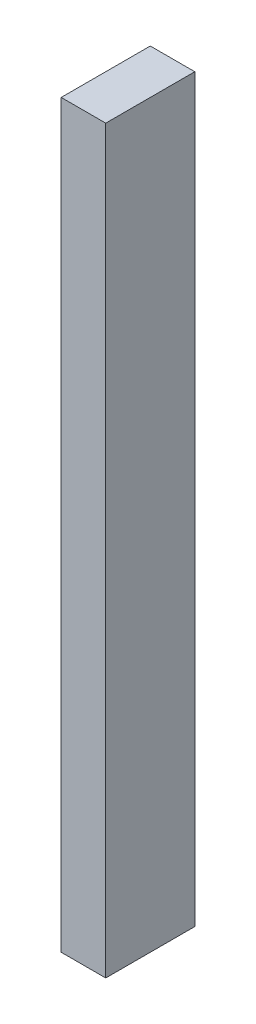
ISO-10303-21;
HEADER;
FILE_DESCRIPTION(('STEP AP214'),'2;1');
FILE_NAME('part.step','',(''),(''),'','','');
FILE_SCHEMA(('AUTOMOTIVE_DESIGN { 1 0 10303 214 1 1 1 1 }'));
ENDSEC;
DATA;
#1=APPLICATION_CONTEXT('core data for automotive mechanical design processes');
#2=APPLICATION_PROTOCOL_DEFINITION('international standard','automotive_design',2000,#1);
#3=PRODUCT_CONTEXT('',#1,'mechanical');
#4=PRODUCT('Part','Part','',(#3));
#5=PRODUCT_RELATED_PRODUCT_CATEGORY('part','',(#4));
#6=PRODUCT_DEFINITION_FORMATION('','',#4);
#7=PRODUCT_DEFINITION_CONTEXT('part definition',#1,'design');
#8=PRODUCT_DEFINITION('design','',#6,#7);
#9=PRODUCT_DEFINITION_SHAPE('','',#8);
#10=(LENGTH_UNIT() NAMED_UNIT(*) SI_UNIT(.MILLI.,.METRE.));
#11=(NAMED_UNIT(*) PLANE_ANGLE_UNIT() SI_UNIT($,.RADIAN.));
#12=(NAMED_UNIT(*) SI_UNIT($,.STERADIAN.) SOLID_ANGLE_UNIT());
#13=UNCERTAINTY_MEASURE_WITH_UNIT(LENGTH_MEASURE(1.E-05),#10,'distance_accuracy_value','');
#14=(GEOMETRIC_REPRESENTATION_CONTEXT(3) GLOBAL_UNCERTAINTY_ASSIGNED_CONTEXT((#13)) GLOBAL_UNIT_ASSIGNED_CONTEXT((#10,
#11,#12)) REPRESENTATION_CONTEXT('',''));
#15=CARTESIAN_POINT('',(0.,0.,0.));
#16=DIRECTION('',(0.,0.,1.));
#17=DIRECTION('',(1.,0.,0.));
#18=AXIS2_PLACEMENT_3D('',#15,#16,#17);
#19=CARTESIAN_POINT('',(20.,643.535374394308,-365.876083198962));
#20=DIRECTION('',(0.,-1.,0.));
#21=DIRECTION('',(0.,0.,-1.));
#22=AXIS2_PLACEMENT_3D('',#19,#20,#21);
#23=PLANE('',#22);
#24=DIRECTION('',(0.,0.,1.));
#25=VECTOR('',#24,1.);
#26=CARTESIAN_POINT('',(0.,643.535374394308,-365.876083198962));
#27=LINE('',#26,#25);
#28=CARTESIAN_POINT('',(0.,643.535374394308,-405.876083198962));
#29=VERTEX_POINT('',#28);
#30=CARTESIAN_POINT('',(0.,643.535374394308,-365.876083198962));
#31=VERTEX_POINT('',#30);
#32=EDGE_CURVE('E96',#29,#31,#27,.T.);
#33=ORIENTED_EDGE('',*,*,#32,.T.);
#34=DIRECTION('',(-1.,0.,0.));
#35=VECTOR('',#34,1.);
#36=CARTESIAN_POINT('',(20.,643.535374394308,-365.876083198962));
#37=LINE('',#36,#35);
#38=CARTESIAN_POINT('',(20.,643.535374394308,-365.876083198962));
#39=VERTEX_POINT('',#38);
#40=EDGE_CURVE('E11',#39,#31,#37,.T.);
#41=ORIENTED_EDGE('',*,*,#40,.F.);
#42=DIRECTION('',(0.,0.,1.));
#43=VECTOR('',#42,1.);
#44=CARTESIAN_POINT('',(20.,643.535374394308,-365.876083198962));
#45=LINE('',#44,#43);
#46=CARTESIAN_POINT('',(20.,643.535374394308,-405.876083198962));
#47=VERTEX_POINT('',#46);
#48=EDGE_CURVE('E84',#47,#39,#45,.T.);
#49=ORIENTED_EDGE('',*,*,#48,.F.);
#50=DIRECTION('',(-1.,0.,0.));
#51=VECTOR('',#50,1.);
#52=CARTESIAN_POINT('',(20.,643.535374394308,-405.876083198962));
#53=LINE('',#52,#51);
#54=EDGE_CURVE('E92',#47,#29,#53,.T.);
#55=ORIENTED_EDGE('',*,*,#54,.T.);
#56=EDGE_LOOP('',(#33,#41,#49,#55));
#57=FACE_BOUND('',#56,.T.);
#58=ADVANCED_FACE('F33',(#57),#23,.F.);
#59=CARTESIAN_POINT('',(20.,643.535374394308,-365.876083198962));
#60=DIRECTION('',(0.,0.,-1.));
#61=DIRECTION('',(-1.,0.,0.));
#62=AXIS2_PLACEMENT_3D('',#59,#60,#61);
#63=PLANE('',#62);
#64=DIRECTION('',(0.,-1.,0.));
#65=VECTOR('',#64,1.);
#66=CARTESIAN_POINT('',(0.,643.535374394308,-365.876083198962));
#67=LINE('',#66,#65);
#68=CARTESIAN_POINT('',(0.,311.035374394308,-365.876083198962));
#69=VERTEX_POINT('',#68);
#70=EDGE_CURVE('E88',#31,#69,#67,.T.);
#71=ORIENTED_EDGE('',*,*,#70,.T.);
#72=DIRECTION('',(-1.,0.,0.));
#73=VECTOR('',#72,1.);
#74=CARTESIAN_POINT('',(20.,311.035374394308,-365.876083198962));
#75=LINE('',#74,#73);
#76=CARTESIAN_POINT('',(20.,311.035374394308,-365.876083198962));
#77=VERTEX_POINT('',#76);
#78=EDGE_CURVE('E41',#77,#69,#75,.T.);
#79=ORIENTED_EDGE('',*,*,#78,.F.);
#80=DIRECTION('',(0.,-1.,0.));
#81=VECTOR('',#80,1.);
#82=CARTESIAN_POINT('',(20.,643.535374394308,-365.876083198962));
#83=LINE('',#82,#81);
#84=EDGE_CURVE('E79',#39,#77,#83,.T.);
#85=ORIENTED_EDGE('',*,*,#84,.F.);
#86=ORIENTED_EDGE('',*,*,#40,.T.);
#87=EDGE_LOOP('',(#71,#79,#85,#86));
#88=FACE_BOUND('',#87,.T.);
#89=ADVANCED_FACE('F87',(#88),#63,.F.);
#90=CARTESIAN_POINT('',(20.,311.035374394308,-405.876083198963));
#91=DIRECTION('',(0.,1.,0.));
#92=DIRECTION('',(0.,0.,1.));
#93=AXIS2_PLACEMENT_3D('',#90,#91,#92);
#94=PLANE('',#93);
#95=DIRECTION('',(0.,0.,-1.));
#96=VECTOR('',#95,1.);
#97=CARTESIAN_POINT('',(0.,311.035374394308,-405.876083198963));
#98=LINE('',#97,#96);
#99=CARTESIAN_POINT('',(0.,311.035374394308,-405.876083198963));
#100=VERTEX_POINT('',#99);
#101=EDGE_CURVE('E66',#69,#100,#98,.T.);
#102=ORIENTED_EDGE('',*,*,#101,.T.);
#103=DIRECTION('',(-1.,0.,0.));
#104=VECTOR('',#103,1.);
#105=CARTESIAN_POINT('',(20.,311.035374394308,-405.876083198963));
#106=LINE('',#105,#104);
#107=CARTESIAN_POINT('',(20.,311.035374394308,-405.876083198963));
#108=VERTEX_POINT('',#107);
#109=EDGE_CURVE('E89',#108,#100,#106,.T.);
#110=ORIENTED_EDGE('',*,*,#109,.F.);
#111=DIRECTION('',(0.,0.,-1.));
#112=VECTOR('',#111,1.);
#113=CARTESIAN_POINT('',(20.,311.035374394308,-405.876083198963));
#114=LINE('',#113,#112);
#115=EDGE_CURVE('E82',#77,#108,#114,.T.);
#116=ORIENTED_EDGE('',*,*,#115,.F.);
#117=ORIENTED_EDGE('',*,*,#78,.T.);
#118=EDGE_LOOP('',(#102,#110,#116,#117));
#119=FACE_BOUND('',#118,.T.);
#120=ADVANCED_FACE('F90',(#119),#94,.F.);
#121=CARTESIAN_POINT('',(20.,643.535374394308,-405.876083198962));
#122=DIRECTION('',(0.,0.,1.));
#123=DIRECTION('',(0.,-1.,0.));
#124=AXIS2_PLACEMENT_3D('',#121,#122,#123);
#125=PLANE('',#124);
#126=DIRECTION('',(0.,1.,0.));
#127=VECTOR('',#126,1.);
#128=CARTESIAN_POINT('',(0.,643.535374394308,-405.876083198962));
#129=LINE('',#128,#127);
#130=EDGE_CURVE('E72',#100,#29,#129,.T.);
#131=ORIENTED_EDGE('',*,*,#130,.T.);
#132=ORIENTED_EDGE('',*,*,#54,.F.);
#133=DIRECTION('',(0.,1.,0.));
#134=VECTOR('',#133,1.);
#135=CARTESIAN_POINT('',(20.,643.535374394308,-405.876083198962));
#136=LINE('',#135,#134);
#137=EDGE_CURVE('E49',#108,#47,#136,.T.);
#138=ORIENTED_EDGE('',*,*,#137,.F.);
#139=ORIENTED_EDGE('',*,*,#109,.T.);
#140=EDGE_LOOP('',(#131,#132,#138,#139));
#141=FACE_BOUND('',#140,.T.);
#142=ADVANCED_FACE('F103',(#141),#125,.F.);
#143=CARTESIAN_POINT('',(20.,0.,0.));
#144=DIRECTION('',(-1.,0.,0.));
#145=DIRECTION('',(0.,0.,1.));
#146=AXIS2_PLACEMENT_3D('',#143,#144,#145);
#147=PLANE('',#146);
#148=ORIENTED_EDGE('',*,*,#48,.T.);
#149=ORIENTED_EDGE('',*,*,#84,.T.);
#150=ORIENTED_EDGE('',*,*,#115,.T.);
#151=ORIENTED_EDGE('',*,*,#137,.T.);
#152=EDGE_LOOP('',(#148,#149,#150,#151));
#153=FACE_BOUND('',#152,.T.);
#154=ADVANCED_FACE('F80',(#153),#147,.F.);
#155=CARTESIAN_POINT('',(0.,0.,0.));
#156=DIRECTION('',(-1.,0.,0.));
#157=DIRECTION('',(0.,0.,1.));
#158=AXIS2_PLACEMENT_3D('',#155,#156,#157);
#159=PLANE('',#158);
#160=ORIENTED_EDGE('',*,*,#32,.F.);
#161=ORIENTED_EDGE('',*,*,#130,.F.);
#162=ORIENTED_EDGE('',*,*,#101,.F.);
#163=ORIENTED_EDGE('',*,*,#70,.F.);
#164=EDGE_LOOP('',(#160,#161,#162,#163));
#165=FACE_BOUND('',#164,.T.);
#166=ADVANCED_FACE('F106',(#165),#159,.T.);
#167=CLOSED_SHELL('',(#58,#89,#120,#142,#154,#166));
#168=MANIFOLD_SOLID_BREP('B2',#167);
#169=ADVANCED_BREP_SHAPE_REPRESENTATION('',(#18,#168),#14);
#170=SHAPE_DEFINITION_REPRESENTATION(#9,#169);
ENDSEC;
END-ISO-10303-21;
